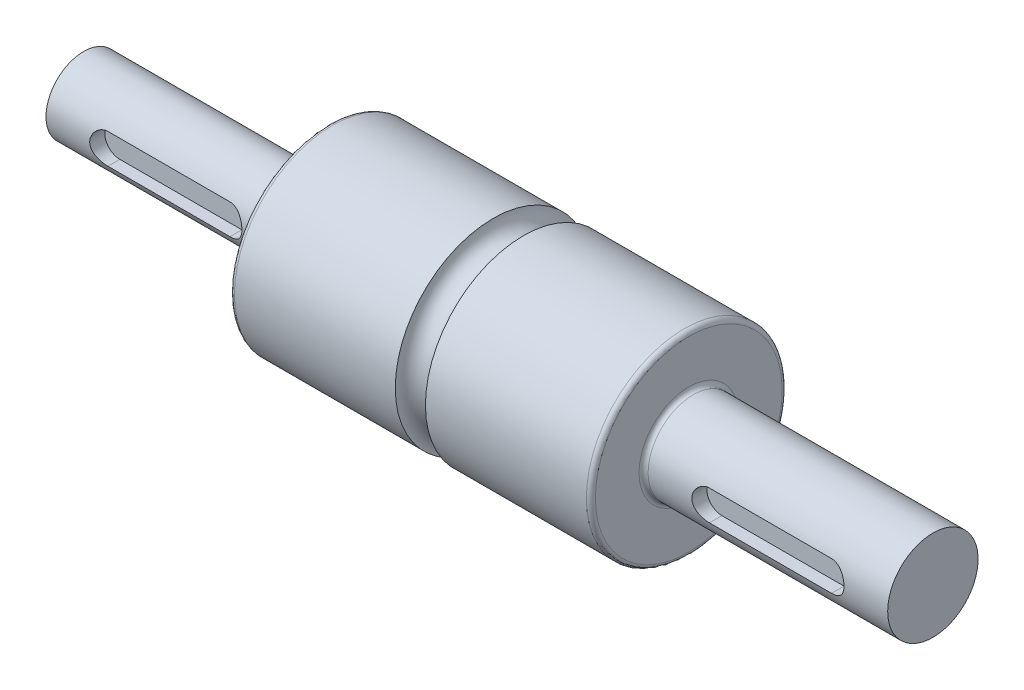
ISO-10303-21;
HEADER;
FILE_DESCRIPTION(('STEP AP214'),'2;1');
FILE_NAME('part.step','',(''),(''),'','','');
FILE_SCHEMA(('AUTOMOTIVE_DESIGN { 1 0 10303 214 1 1 1 1 }'));
ENDSEC;
DATA;
#1=APPLICATION_CONTEXT('core data for automotive mechanical design processes');
#2=APPLICATION_PROTOCOL_DEFINITION('international standard','automotive_design',2000,#1);
#3=PRODUCT_CONTEXT('',#1,'mechanical');
#4=PRODUCT('Part','Part','',(#3));
#5=PRODUCT_RELATED_PRODUCT_CATEGORY('part','',(#4));
#6=PRODUCT_DEFINITION_FORMATION('','',#4);
#7=PRODUCT_DEFINITION_CONTEXT('part definition',#1,'design');
#8=PRODUCT_DEFINITION('design','',#6,#7);
#9=PRODUCT_DEFINITION_SHAPE('','',#8);
#10=(LENGTH_UNIT() NAMED_UNIT(*) SI_UNIT(.MILLI.,.METRE.));
#11=(NAMED_UNIT(*) PLANE_ANGLE_UNIT() SI_UNIT($,.RADIAN.));
#12=(NAMED_UNIT(*) SI_UNIT($,.STERADIAN.) SOLID_ANGLE_UNIT());
#13=UNCERTAINTY_MEASURE_WITH_UNIT(LENGTH_MEASURE(1.E-05),#10,'distance_accuracy_value','');
#14=(GEOMETRIC_REPRESENTATION_CONTEXT(3) GLOBAL_UNCERTAINTY_ASSIGNED_CONTEXT((#13)) GLOBAL_UNIT_ASSIGNED_CONTEXT((#10,
#11,#12)) REPRESENTATION_CONTEXT('',''));
#15=CARTESIAN_POINT('',(0.,0.,0.));
#16=DIRECTION('',(0.,0.,1.));
#17=DIRECTION('',(1.,0.,0.));
#18=AXIS2_PLACEMENT_3D('',#15,#16,#17);
#19=CARTESIAN_POINT('',(-140.903426941993,0.,0.));
#20=DIRECTION('',(-1.,0.,0.));
#21=DIRECTION('',(0.,0.,1.));
#22=AXIS2_PLACEMENT_3D('',#19,#20,#21);
#23=CYLINDRICAL_SURFACE('',#22,12.5);
#24=CARTESIAN_POINT('',(-61.4034269419929,0.,0.));
#25=DIRECTION('',(-1.,0.,0.));
#26=DIRECTION('',(0.,0.,1.));
#27=AXIS2_PLACEMENT_3D('',#24,#25,#26);
#28=CIRCLE('',#27,12.5);
#29=CARTESIAN_POINT('',(-61.4034269419929,0.,12.5));
#30=VERTEX_POINT('',#29);
#31=EDGE_CURVE('E153',#30,#30,#28,.T.);
#32=ORIENTED_EDGE('',*,*,#31,.T.);
#33=EDGE_LOOP('',(#32));
#34=FACE_BOUND('',#33,.T.);
#35=CARTESIAN_POINT('',(-140.903426941993,0.,0.));
#36=DIRECTION('',(-1.,0.,0.));
#37=DIRECTION('',(0.,0.,1.));
#38=AXIS2_PLACEMENT_3D('',#35,#36,#37);
#39=CIRCLE('',#38,12.5);
#40=CARTESIAN_POINT('',(-140.903426941993,0.,12.5));
#41=VERTEX_POINT('',#40);
#42=EDGE_CURVE('E143',#41,#41,#39,.T.);
#43=ORIENTED_EDGE('',*,*,#42,.F.);
#44=EDGE_LOOP('',(#43));
#45=FACE_BOUND('',#44,.T.);
#46=CARTESIAN_POINT('',(-80.9034269419929,-4.99999999999999,11.4564392373896));
#47=CARTESIAN_POINT('',(-80.7689145099322,-5.00002116024615,11.4564109509945));
#48=CARTESIAN_POINT('',(-80.6344138774533,-4.99457288869912,11.4588073206432));
#49=CARTESIAN_POINT('',(-80.3664975973184,-4.97289704500258,11.4682409636927));
#50=CARTESIAN_POINT('',(-80.2330815560139,-4.956673578293,11.4752764695362));
#51=CARTESIAN_POINT('',(-79.9688120770579,-4.91369129558914,11.4937439172796));
#52=CARTESIAN_POINT('',(-79.8379506300949,-4.88697412617558,11.5051584758264));
#53=CARTESIAN_POINT('',(-79.5791673640281,-4.82328654884512,11.5320036246689));
#54=CARTESIAN_POINT('',(-79.4512457248801,-4.78631551505479,11.5474344601058));
#55=CARTESIAN_POINT('',(-79.1993475743696,-4.70252103978113,11.5818106822086));
#56=CARTESIAN_POINT('',(-79.0753660459993,-4.65571075709795,11.6007513709062));
#57=CARTESIAN_POINT('',(-78.8318982133711,-4.55261160789533,11.6415978912418));
#58=CARTESIAN_POINT('',(-78.712413619784,-4.49631917799882,11.6635048369856));
#59=CARTESIAN_POINT('',(-78.3616167016076,-4.31376922877806,11.7327894866887));
#60=CARTESIAN_POINT('',(-78.1379443037477,-4.17383337305164,11.7837334464308));
#61=CARTESIAN_POINT('',(-77.7052249611352,-3.85328699437739,11.8925290853841));
#62=CARTESIAN_POINT('',(-77.4975177463674,-3.67095756312254,11.9506010980043));
#63=CARTESIAN_POINT('',(-77.1145674128227,-3.27420643347812,12.0653248053599));
#64=CARTESIAN_POINT('',(-76.9393309589029,-3.05977816286385,12.1219762064459));
#65=CARTESIAN_POINT('',(-76.7012817321614,-2.71343385084923,12.2025476404464));
#66=CARTESIAN_POINT('',(-76.6248600926509,-2.59127203287565,12.2291340013039));
#67=CARTESIAN_POINT('',(-76.4826481872213,-2.34039970046144,12.2796116610866));
#68=CARTESIAN_POINT('',(-76.4168535406812,-2.2116919132934,12.3035040692708));
#69=CARTESIAN_POINT('',(-76.296471355473,-1.94856415474315,12.3479110926869));
#70=CARTESIAN_POINT('',(-76.2418850217459,-1.81414357108409,12.3684253447059));
#71=CARTESIAN_POINT('',(-76.1444868886821,-1.54063203940556,12.4054617264858));
#72=CARTESIAN_POINT('',(-76.1016693620618,-1.40154340020458,12.4219857975888));
#73=CARTESIAN_POINT('',(-76.0300074414814,-1.12649875188949,12.4498667432373));
#74=CARTESIAN_POINT('',(-76.0005908579256,-0.990712972335666,12.4614336192513));
#75=CARTESIAN_POINT('',(-75.9531428165173,-0.716923447432036,12.480177753411));
#76=CARTESIAN_POINT('',(-75.9351063772532,-0.578920699677037,12.4873569321328));
#77=CARTESIAN_POINT('',(-75.9106014092476,-0.301742928083764,12.4971268844119));
#78=CARTESIAN_POINT('',(-75.904131781342,-0.162568016896079,12.4997180939517));
#79=CARTESIAN_POINT('',(-75.902831267005,0.11584248401282,12.5002382405049));
#80=CARTESIAN_POINT('',(-75.9079999715092,0.255078071429409,12.4981673413824));
#81=CARTESIAN_POINT('',(-75.9292961273385,0.524651970400528,12.4896713366005));
#82=CARTESIAN_POINT('',(-75.9447886936776,0.655048966944706,12.4834985427991));
#83=CARTESIAN_POINT('',(-75.9859316516079,0.914022837957844,12.4672131439381));
#84=CARTESIAN_POINT('',(-76.0115854189115,1.04259909282974,12.4570992295938));
#85=CARTESIAN_POINT('',(-76.0728006142319,1.29697755626965,12.4331876533791));
#86=CARTESIAN_POINT('',(-76.1083586179993,1.42278070740582,12.4193912647406));
#87=CARTESIAN_POINT('',(-76.189060985113,1.67086757221269,12.3884570972524));
#88=CARTESIAN_POINT('',(-76.2342089890808,1.79314992921951,12.3713180496423));
#89=CARTESIAN_POINT('',(-76.3849727762489,2.15709687028231,12.3149325863107));
#90=CARTESIAN_POINT('',(-76.5050355642606,2.39225143382082,12.2710729537441));
#91=CARTESIAN_POINT('',(-76.7796028983251,2.83955938188376,12.175361464094));
#92=CARTESIAN_POINT('',(-76.9341195274145,3.05170465810878,12.1235068051106));
#93=CARTESIAN_POINT('',(-77.2850235281358,3.46189166322701,12.0130472510456));
#94=CARTESIAN_POINT('',(-77.4834922991716,3.65809600081908,11.9542226888218));
#95=CARTESIAN_POINT('',(-77.9109180274534,4.01527141902241,11.8390417472991));
#96=CARTESIAN_POINT('',(-78.1398887985308,4.17622644798527,11.7826865017702));
#97=CARTESIAN_POINT('',(-78.505471408025,4.38982639253536,11.7040767056709));
#98=CARTESIAN_POINT('',(-78.6330167098421,4.45714070918033,11.67853963431));
#99=CARTESIAN_POINT('',(-78.8939173367072,4.58068459393731,11.6306369662179));
#100=CARTESIAN_POINT('',(-79.0272701269839,4.6369189400321,11.6082700036232));
#101=CARTESIAN_POINT('',(-79.2987130988223,4.73770315812051,11.5675031334143));
#102=CARTESIAN_POINT('',(-79.4367971528492,4.78226754199409,11.5490983039107));
#103=CARTESIAN_POINT('',(-79.7167624038732,4.85931060760165,11.5168933461878));
#104=CARTESIAN_POINT('',(-79.8586418677499,4.89179470795395,11.5030911537407));
#105=CARTESIAN_POINT('',(-80.1502337506556,4.94524241843461,11.4802224777034));
#106=CARTESIAN_POINT('',(-80.3000446849432,4.96575156895816,11.4713433844497));
#107=CARTESIAN_POINT('',(-80.6010406036684,4.99314310596511,11.4594310700134));
#108=CARTESIAN_POINT('',(-80.7522246836546,5.00003388913651,11.4563942466884));
#109=CARTESIAN_POINT('',(-80.9034269419929,5.00000000000001,11.4564392373896));
#110=B_SPLINE_CURVE_WITH_KNOTS('',3,(#46,#47,#48,#49,#50,#51,#52,#53,#54,#55,#56,#57,#58,#59,
#60,#61,#62,#63,#64,#65,#66,#67,#68,#69,#70,#71,#72,#73,#74,#75,#76,#77,#78,#79,#80,#81,#82,#83,
#84,#85,#86,#87,#88,#89,#90,#91,#92,#93,#94,#95,#96,#97,#98,#99,#100,#101,#102,#103,#104,#105,
#106,#107,#108,#109),.UNSPECIFIED.,.F.,.F.,(4,2,2,2,2,2,2,2,2,2,2,2,2,2,2,2,2,2,2,2,2,2,2,2,2,2,
2,2,2,2,2,4),(0.,0.403387132772967,0.806620659758033,1.20826977817944,1.60994341778076,
2.01108324721977,2.41237416211888,3.21490253133678,4.05861785764903,4.90250617122555,
5.34163056425763,5.78057347846698,6.21956355621624,6.65833961990578,7.07604861266467,
7.49357463528173,7.91106097937955,8.32853264988811,8.72244552722556,9.11648937858481,
9.5103971636113,9.90445475472552,10.7036301452728,11.5030862504096,12.3549725889497,
13.2072460521693,13.6461605184395,14.0848852966823,14.5230618911476,14.9610417034976,
15.4147136276399,15.8681057435336),.UNSPECIFIED.);
#111=CARTESIAN_POINT('',(-80.9034269419929,-4.99999999999999,11.4564392373896));
#112=VERTEX_POINT('',#111);
#113=CARTESIAN_POINT('',(-80.9034269419929,5.00000000000001,11.4564392373896));
#114=VERTEX_POINT('',#113);
#115=EDGE_CURVE('E186',#112,#114,#110,.T.);
#116=ORIENTED_EDGE('',*,*,#115,.F.);
#117=DIRECTION('',(-1.,0.,0.));
#118=VECTOR('',#117,1.);
#119=CARTESIAN_POINT('',(-140.903426941993,-4.99999999999999,11.4564392373896));
#120=LINE('',#119,#118);
#121=CARTESIAN_POINT('',(-121.403426941993,-4.99999999999999,11.4564392373896));
#122=VERTEX_POINT('',#121);
#123=EDGE_CURVE('E219',#112,#122,#120,.T.);
#124=ORIENTED_EDGE('',*,*,#123,.T.);
#125=CARTESIAN_POINT('',(-121.403426941993,-4.99999999999999,11.4564392373896));
#126=CARTESIAN_POINT('',(-121.537939374054,-5.00002116024615,11.4564109509945));
#127=CARTESIAN_POINT('',(-121.672440006532,-4.99457288869912,11.4588073206432));
#128=CARTESIAN_POINT('',(-121.940356286667,-4.97289704500258,11.4682409636927));
#129=CARTESIAN_POINT('',(-122.073772327972,-4.95667357829299,11.4752764695362));
#130=CARTESIAN_POINT('',(-122.338041806928,-4.91369129558913,11.4937439172796));
#131=CARTESIAN_POINT('',(-122.468903253891,-4.88697412617557,11.5051584758264));
#132=CARTESIAN_POINT('',(-122.727686519958,-4.82328654884511,11.5320036246689));
#133=CARTESIAN_POINT('',(-122.855608159106,-4.78631551505477,11.5474344601058));
#134=CARTESIAN_POINT('',(-123.107506309616,-4.7025210397811,11.5818106822086));
#135=CARTESIAN_POINT('',(-123.231487837986,-4.65571075709793,11.6007513709062));
#136=CARTESIAN_POINT('',(-123.474955670615,-4.55261160789531,11.6415978912418));
#137=CARTESIAN_POINT('',(-123.594440264202,-4.49631917799879,11.6635048369856));
#138=CARTESIAN_POINT('',(-123.945237182378,-4.31376922877803,11.7327894866887));
#139=CARTESIAN_POINT('',(-124.168909580238,-4.17383337305161,11.7837334464308));
#140=CARTESIAN_POINT('',(-124.601628922851,-3.85328699437734,11.8925290853841));
#141=CARTESIAN_POINT('',(-124.809336137618,-3.67095756312249,11.9506010980043));
#142=CARTESIAN_POINT('',(-125.192286471163,-3.27420643347807,12.0653248053599));
#143=CARTESIAN_POINT('',(-125.367522925083,-3.0597781628638,12.1219762064459));
#144=CARTESIAN_POINT('',(-125.605572151824,-2.71343385084917,12.2025476404464));
#145=CARTESIAN_POINT('',(-125.681993791335,-2.59127203287558,12.229134001304));
#146=CARTESIAN_POINT('',(-125.824205696764,-2.34039970046137,12.2796116610866));
#147=CARTESIAN_POINT('',(-125.890000343305,-2.21169191329334,12.3035040692708));
#148=CARTESIAN_POINT('',(-126.010382528513,-1.9485641547431,12.3479110926869));
#149=CARTESIAN_POINT('',(-126.06496886224,-1.81414357108403,12.3684253447059));
#150=CARTESIAN_POINT('',(-126.162366995304,-1.5406320394055,12.4054617264858));
#151=CARTESIAN_POINT('',(-126.205184521924,-1.40154340020451,12.4219857975888));
#152=CARTESIAN_POINT('',(-126.276846442504,-1.12649875188942,12.4498667432373));
#153=CARTESIAN_POINT('',(-126.30626302606,-0.990712972335597,12.4614336192513));
#154=CARTESIAN_POINT('',(-126.353711067468,-0.716923447431965,12.480177753411));
#155=CARTESIAN_POINT('',(-126.371747506732,-0.578920699676965,12.4873569321328));
#156=CARTESIAN_POINT('',(-126.396252474738,-0.301742928083693,12.4971268844119));
#157=CARTESIAN_POINT('',(-126.402722102644,-0.162568016896009,12.4997180939517));
#158=CARTESIAN_POINT('',(-126.404022616981,0.115842484012888,12.5002382405049));
#159=CARTESIAN_POINT('',(-126.398853912476,0.255078071429476,12.4981673413824));
#160=CARTESIAN_POINT('',(-126.377557756647,0.524651970400594,12.4896713366005));
#161=CARTESIAN_POINT('',(-126.362065190308,0.655048966944771,12.4834985427991));
#162=CARTESIAN_POINT('',(-126.320922232378,0.914022837957908,12.4672131439381));
#163=CARTESIAN_POINT('',(-126.295268465074,1.0425990928298,12.4570992295938));
#164=CARTESIAN_POINT('',(-126.234053269754,1.29697755626972,12.4331876533791));
#165=CARTESIAN_POINT('',(-126.198495265986,1.42278070740589,12.4193912647406));
#166=CARTESIAN_POINT('',(-126.117792898873,1.67086757221275,12.3884570972524));
#167=CARTESIAN_POINT('',(-126.072644894905,1.79314992921957,12.3713180496423));
#168=CARTESIAN_POINT('',(-125.921881107737,2.15709687028237,12.3149325863107));
#169=CARTESIAN_POINT('',(-125.801818319725,2.39225143382088,12.2710729537441));
#170=CARTESIAN_POINT('',(-125.527250985661,2.83955938188382,12.175361464094));
#171=CARTESIAN_POINT('',(-125.372734356571,3.05170465810884,12.1235068051106));
#172=CARTESIAN_POINT('',(-125.02183035585,3.46189166322706,12.0130472510456));
#173=CARTESIAN_POINT('',(-124.823361584814,3.65809600081913,11.9542226888217));
#174=CARTESIAN_POINT('',(-124.395935856532,4.01527141902245,11.8390417472991));
#175=CARTESIAN_POINT('',(-124.166965085455,4.17622644798531,11.7826865017702));
#176=CARTESIAN_POINT('',(-123.801382475961,4.38982639253539,11.7040767056709));
#177=CARTESIAN_POINT('',(-123.673837174144,4.45714070918036,11.67853963431));
#178=CARTESIAN_POINT('',(-123.412936547278,4.58068459393734,11.6306369662179));
#179=CARTESIAN_POINT('',(-123.279583757002,4.63691894003213,11.6082700036232));
#180=CARTESIAN_POINT('',(-123.008140785163,4.73770315812053,11.5675031334143));
#181=CARTESIAN_POINT('',(-122.870056731136,4.78226754199411,11.5490983039106));
#182=CARTESIAN_POINT('',(-122.590091480112,4.85931060760167,11.5168933461878));
#183=CARTESIAN_POINT('',(-122.448212016236,4.89179470795396,11.5030911537407));
#184=CARTESIAN_POINT('',(-122.15662013333,4.94524241843462,11.4802224777034));
#185=CARTESIAN_POINT('',(-122.006809199042,4.96575156895816,11.4713433844497));
#186=CARTESIAN_POINT('',(-121.705813280317,4.99314310596511,11.4594310700134));
#187=CARTESIAN_POINT('',(-121.554629200331,5.00003388913651,11.4563942466884));
#188=CARTESIAN_POINT('',(-121.403426941993,5.00000000000001,11.4564392373896));
#189=B_SPLINE_CURVE_WITH_KNOTS('',3,(#125,#126,#127,#128,#129,#130,#131,#132,#133,#134,#135,
#136,#137,#138,#139,#140,#141,#142,#143,#144,#145,#146,#147,#148,#149,#150,#151,#152,#153,#154,
#155,#156,#157,#158,#159,#160,#161,#162,#163,#164,#165,#166,#167,#168,#169,#170,#171,#172,#173,
#174,#175,#176,#177,#178,#179,#180,#181,#182,#183,#184,#185,#186,#187,#188),.UNSPECIFIED.,.F.,
.F.,(4,2,2,2,2,2,2,2,2,2,2,2,2,2,2,2,2,2,2,2,2,2,2,2,2,2,2,2,2,2,2,4),(0.,0.403387132772981,
0.806620659758047,1.20826977817943,1.60994341778078,2.01108324721978,2.4123741621189,
3.21490253133681,4.05861785764907,4.90250617122559,5.34163056425766,5.780573478467,
6.21956355621627,6.65833961990581,7.07604861266471,7.49357463528176,7.91106097937958,
8.32853264988813,8.72244552722559,9.11648937858483,9.51039716361132,9.90445475472555,
10.7036301452729,11.5030862504097,12.3549725889497,13.2072460521693,13.6461605184396,
14.0848852966823,14.5230618911476,14.9610417034976,15.4147136276399,15.8681057435335),.UNSPECIFIED.);
#190=CARTESIAN_POINT('',(-121.403426941993,5.00000000000001,11.4564392373896));
#191=VERTEX_POINT('',#190);
#192=EDGE_CURVE('E56',#122,#191,#189,.T.);
#193=ORIENTED_EDGE('',*,*,#192,.T.);
#194=DIRECTION('',(-1.,0.,0.));
#195=VECTOR('',#194,1.);
#196=CARTESIAN_POINT('',(-140.903426941993,5.00000000000001,11.4564392373896));
#197=LINE('',#196,#195);
#198=EDGE_CURVE('E193',#114,#191,#197,.T.);
#199=ORIENTED_EDGE('',*,*,#198,.F.);
#200=EDGE_LOOP('',(#116,#124,#193,#199));
#201=FACE_BOUND('',#200,.T.);
#202=ADVANCED_FACE('F33',(#34,#45,#201),#23,.T.);
#203=CARTESIAN_POINT('',(140.903426941993,0.,-15.));
#204=DIRECTION('',(-1.,0.,0.));
#205=DIRECTION('',(0.,0.,1.));
#206=AXIS2_PLACEMENT_3D('',#203,#204,#205);
#207=PLANE('',#206);
#208=CARTESIAN_POINT('',(140.903426941993,0.,0.));
#209=DIRECTION('',(-1.,0.,0.));
#210=DIRECTION('',(0.,0.,1.));
#211=AXIS2_PLACEMENT_3D('',#208,#209,#210);
#212=CIRCLE('',#211,15.);
#213=CARTESIAN_POINT('',(140.903426941993,0.,15.));
#214=VERTEX_POINT('',#213);
#215=EDGE_CURVE('E183',#214,#214,#212,.T.);
#216=ORIENTED_EDGE('',*,*,#215,.F.);
#217=EDGE_LOOP('',(#216));
#218=FACE_BOUND('',#217,.T.);
#219=ADVANCED_FACE('F35',(#218),#207,.F.);
#220=CARTESIAN_POINT('',(-140.903426941993,0.,0.));
#221=DIRECTION('',(-1.,0.,0.));
#222=DIRECTION('',(0.,0.,1.));
#223=AXIS2_PLACEMENT_3D('',#220,#221,#222);
#224=CYLINDRICAL_SURFACE('',#223,15.);
#225=DIRECTION('',(-1.,0.,0.));
#226=VECTOR('',#225,1.);
#227=CARTESIAN_POINT('',(-140.903426941993,5.00000000000001,14.1421356237309));
#228=LINE('',#227,#226);
#229=CARTESIAN_POINT('',(80.9034269419929,5.00000000000001,14.1421356237309));
#230=VERTEX_POINT('',#229);
#231=CARTESIAN_POINT('',(121.403426941993,5.00000000000001,14.1421356237309));
#232=VERTEX_POINT('',#231);
#233=EDGE_CURVE('E11',#230,#232,#228,.F.);
#234=ORIENTED_EDGE('',*,*,#233,.T.);
#235=CARTESIAN_POINT('',(121.403426941993,5.00000000000001,14.1421356237309));
#236=CARTESIAN_POINT('',(121.5398387699,5.00001928272081,14.1421132795953));
#237=CARTESIAN_POINT('',(121.676241927634,4.99441839460029,14.144108585197));
#238=CARTESIAN_POINT('',(121.947990182087,4.97212026561632,14.1519707752355));
#239=CARTESIAN_POINT('',(122.083335554446,4.95542602013329,14.1578366145644));
#240=CARTESIAN_POINT('',(122.351605599094,4.9111504844288,14.1732535212275));
#241=CARTESIAN_POINT('',(122.484536238896,4.88360148534077,14.182793656248));
#242=CARTESIAN_POINT('',(122.74745158765,4.81787909036064,14.2052544389481));
#243=CARTESIAN_POINT('',(122.877436189951,4.7797053104926,14.2181752088016));
#244=CARTESIAN_POINT('',(123.133485940323,4.69309505128878,14.2469974292543));
#245=CARTESIAN_POINT('',(123.259554161886,4.64466686529956,14.2628964699579));
#246=CARTESIAN_POINT('',(123.507095489933,4.53792631398364,14.2972152683245));
#247=CARTESIAN_POINT('',(123.628566861094,4.47961026060575,14.3156359660384));
#248=CARTESIAN_POINT('',(123.984995870406,4.29042487291369,14.3739242294785));
#249=CARTESIAN_POINT('',(124.212077125632,4.14528130436111,14.4168308914588));
#250=CARTESIAN_POINT('',(124.647064812331,3.81524041281302,14.5077282855086));
#251=CARTESIAN_POINT('',(124.854011190976,3.62912046165337,14.5558450324036));
#252=CARTESIAN_POINT('',(125.23444718253,3.22494665570409,14.6506912904573));
#253=CARTESIAN_POINT('',(125.407930837861,3.00688712664706,14.6974205533428));
#254=CARTESIAN_POINT('',(125.720827276125,2.53801699448505,14.7856944680589));
#255=CARTESIAN_POINT('',(125.859232598254,2.28650011670838,14.8270719634014));
#256=CARTESIAN_POINT('',(126.091387466404,1.76214657981263,14.8984803449503));
#257=CARTESIAN_POINT('',(126.18515065388,1.48931646315736,14.9285146967399));
#258=CARTESIAN_POINT('',(126.322105762804,0.940146645163432,14.9729535792742));
#259=CARTESIAN_POINT('',(126.366943369091,0.664259156539295,14.9878654569488));
#260=CARTESIAN_POINT('',(126.410008370307,0.108494863035997,15.0021804126725));
#261=CARTESIAN_POINT('',(126.40824687138,-0.171380975391754,15.0015871861129));
#262=CARTESIAN_POINT('',(126.359205590794,-0.715519207983796,14.9853019394036));
#263=CARTESIAN_POINT('',(126.31371394512,-0.979963426373997,14.9702030725849));
#264=CARTESIAN_POINT('',(126.181460755688,-1.49722040864169,14.9273480020182));
#265=CARTESIAN_POINT('',(126.094696923543,-1.75003252671054,14.8995910964333));
#266=CARTESIAN_POINT('',(125.881320810713,-2.24076278220397,14.8337834991293));
#267=CARTESIAN_POINT('',(125.754199404086,-2.47844127676372,14.7956022127902));
#268=CARTESIAN_POINT('',(125.464124496602,-2.92962419733436,14.7129190630403));
#269=CARTESIAN_POINT('',(125.301161248662,-3.14312202351081,14.6684154814678));
#270=CARTESIAN_POINT('',(124.935082201863,-3.55048180391257,14.5753148518701));
#271=CARTESIAN_POINT('',(124.730439304146,-3.7429493917037,14.5266237190253));
#272=CARTESIAN_POINT('',(124.291179400284,-4.09137879648189,14.4323697370697));
#273=CARTESIAN_POINT('',(124.056552748239,-4.24732881968221,14.3868079019513));
#274=CARTESIAN_POINT('',(123.685035754024,-4.45137197181609,14.3244699574743));
#275=CARTESIAN_POINT('',(123.556857686034,-4.51477947987291,14.3045606178995));
#276=CARTESIAN_POINT('',(123.295220715797,-4.63050119526382,14.2675208843929));
#277=CARTESIAN_POINT('',(123.161764039398,-4.68282002045477,14.2503893343581));
#278=CARTESIAN_POINT('',(122.890655583785,-4.77584283639461,14.2194841629367));
#279=CARTESIAN_POINT('',(122.753008550613,-4.81655946314395,14.205706890793));
#280=CARTESIAN_POINT('',(122.474466748934,-4.88604801985986,14.1819560641116));
#281=CARTESIAN_POINT('',(122.333573494541,-4.91482540411387,14.1719807728584));
#282=CARTESIAN_POINT('',(122.061373883805,-4.95827453687229,14.156836654448));
#283=CARTESIAN_POINT('',(121.93024004252,-4.97391718926364,14.1513381564974));
#284=CARTESIAN_POINT('',(121.667216526118,-4.99478118687353,14.143980412972));
#285=CARTESIAN_POINT('',(121.535328047408,-5.00001597952915,14.1421164714419));
#286=CARTESIAN_POINT('',(121.403426941993,-4.99999999999999,14.142135623731));
#287=B_SPLINE_CURVE_WITH_KNOTS('',3,(#235,#236,#237,#238,#239,#240,#241,#242,#243,#244,#245,
#246,#247,#248,#249,#250,#251,#252,#253,#254,#255,#256,#257,#258,#259,#260,#261,#262,#263,#264,
#265,#266,#267,#268,#269,#270,#271,#272,#273,#274,#275,#276,#277,#278,#279,#280,#281,#282,#283,
#284,#285,#286),.UNSPECIFIED.,.F.,.F.,(4,2,2,2,2,2,2,2,2,2,2,2,2,2,2,2,2,2,2,2,2,2,2,2,2,4),(0.,
0.409092423677147,0.818074430847297,1.22584885885814,1.63363802561077,2.04109864022585,
2.44871156823775,3.26359482908313,4.10724851154042,4.95105225659391,5.8168799100616,
6.68244281946291,7.5178967997767,8.35315166493869,9.15564418669333,9.95818120881897,
10.7712742047049,11.584588592845,12.4361259663091,13.2879379758687,13.7206337000479,
14.1531488734623,14.5851911765746,15.0170358888757,15.4131122811713,15.8086765909866),.UNSPECIFIED.);
#288=CARTESIAN_POINT('',(121.403426941993,-4.99999999999999,14.142135623731));
#289=VERTEX_POINT('',#288);
#290=EDGE_CURVE('E222',#232,#289,#287,.T.);
#291=ORIENTED_EDGE('',*,*,#290,.T.);
#292=DIRECTION('',(-1.,0.,0.));
#293=VECTOR('',#292,1.);
#294=CARTESIAN_POINT('',(-140.903426941993,-4.99999999999999,14.142135623731));
#295=LINE('',#294,#293);
#296=CARTESIAN_POINT('',(80.9034269419929,-4.99999999999999,14.142135623731));
#297=VERTEX_POINT('',#296);
#298=EDGE_CURVE('E41',#289,#297,#295,.T.);
#299=ORIENTED_EDGE('',*,*,#298,.T.);
#300=CARTESIAN_POINT('',(80.9034269419929,-4.99999999999999,14.142135623731));
#301=CARTESIAN_POINT('',(80.767015114086,-5.0000192827208,14.1421132795953));
#302=CARTESIAN_POINT('',(80.6306119563519,-4.99441839460027,14.144108585197));
#303=CARTESIAN_POINT('',(80.3588637018987,-4.97212026561631,14.1519707752355));
#304=CARTESIAN_POINT('',(80.2235183295394,-4.95542602013328,14.1578366145644));
#305=CARTESIAN_POINT('',(79.9552482848919,-4.91115048442879,14.1732535212275));
#306=CARTESIAN_POINT('',(79.82231764509,-4.88360148534076,14.182793656248));
#307=CARTESIAN_POINT('',(79.5594022963353,-4.81787909036063,14.2052544389481));
#308=CARTESIAN_POINT('',(79.4294176940349,-4.77970531049259,14.2181752088016));
#309=CARTESIAN_POINT('',(79.173367943663,-4.69309505128877,14.2469974292543));
#310=CARTESIAN_POINT('',(79.0472997220997,-4.64466686529955,14.2628964699579));
#311=CARTESIAN_POINT('',(78.7997583940527,-4.53792631398363,14.2972152683245));
#312=CARTESIAN_POINT('',(78.6782870228913,-4.47961026060575,14.3156359660384));
#313=CARTESIAN_POINT('',(78.3218580135801,-4.29042487291369,14.3739242294785));
#314=CARTESIAN_POINT('',(78.094776758354,-4.14528130436111,14.4168308914588));
#315=CARTESIAN_POINT('',(77.6597890716549,-3.81524041281301,14.5077282855086));
#316=CARTESIAN_POINT('',(77.45284269301,-3.62912046165336,14.5558450324036));
#317=CARTESIAN_POINT('',(77.0724067014556,-3.22494665570406,14.6506912904573));
#318=CARTESIAN_POINT('',(76.8989230461245,-3.00688712664704,14.6974205533428));
#319=CARTESIAN_POINT('',(76.5860266078608,-2.53801699448503,14.7856944680589));
#320=CARTESIAN_POINT('',(76.4476212857322,-2.28650011670835,14.8270719634014));
#321=CARTESIAN_POINT('',(76.2154664175814,-1.7621465798126,14.8984803449503));
#322=CARTESIAN_POINT('',(76.1217032301055,-1.48931646315734,14.9285146967399));
#323=CARTESIAN_POINT('',(75.9847481211813,-0.940146645163422,14.9729535792742));
#324=CARTESIAN_POINT('',(75.9399105148952,-0.664259156539287,14.9878654569488));
#325=CARTESIAN_POINT('',(75.8968455136787,-0.108494863035997,15.0021804126725));
#326=CARTESIAN_POINT('',(75.8986070126052,0.171380975391749,15.0015871861129));
#327=CARTESIAN_POINT('',(75.9476482931914,0.715519207983782,14.9853019394036));
#328=CARTESIAN_POINT('',(75.9931399388661,0.979963426373979,14.9702030725849));
#329=CARTESIAN_POINT('',(76.1253931282982,1.49722040864167,14.9273480020182));
#330=CARTESIAN_POINT('',(76.2121569604428,1.75003252671053,14.8995910964333));
#331=CARTESIAN_POINT('',(76.4255330732724,2.24076278220396,14.8337834991293));
#332=CARTESIAN_POINT('',(76.5526544798993,2.47844127676371,14.7956022127902));
#333=CARTESIAN_POINT('',(76.8427293873832,2.92962419733436,14.7129190630403));
#334=CARTESIAN_POINT('',(77.0056926353233,3.1431220235108,14.6684154814678));
#335=CARTESIAN_POINT('',(77.3717716821229,3.55048180391257,14.5753148518701));
#336=CARTESIAN_POINT('',(77.5764145798401,3.7429493917037,14.5266237190253));
#337=CARTESIAN_POINT('',(78.0156744837014,4.09137879648189,14.4323697370697));
#338=CARTESIAN_POINT('',(78.2503011357472,4.24732881968221,14.3868079019513));
#339=CARTESIAN_POINT('',(78.6218181299618,4.45137197181609,14.3244699574743));
#340=CARTESIAN_POINT('',(78.7499961979514,4.51477947987291,14.3045606178995));
#341=CARTESIAN_POINT('',(79.0116331681888,4.63050119526382,14.2675208843929));
#342=CARTESIAN_POINT('',(79.1450898445874,4.68282002045477,14.2503893343581));
#343=CARTESIAN_POINT('',(79.4161983002006,4.77584283639461,14.2194841629367));
#344=CARTESIAN_POINT('',(79.5538453333728,4.81655946314395,14.205706890793));
#345=CARTESIAN_POINT('',(79.832387135052,4.88604801985987,14.1819560641116));
#346=CARTESIAN_POINT('',(79.973280389445,4.91482540411388,14.1719807728584));
#347=CARTESIAN_POINT('',(80.2454800001812,4.9582745368723,14.1568366544479));
#348=CARTESIAN_POINT('',(80.3766138414661,4.97391718926365,14.1513381564974));
#349=CARTESIAN_POINT('',(80.6396373578676,4.99478118687354,14.143980412972));
#350=CARTESIAN_POINT('',(80.7715258365777,5.00001597952917,14.1421164714419));
#351=CARTESIAN_POINT('',(80.9034269419929,5.00000000000001,14.1421356237309));
#352=B_SPLINE_CURVE_WITH_KNOTS('',3,(#300,#301,#302,#303,#304,#305,#306,#307,#308,#309,#310,
#311,#312,#313,#314,#315,#316,#317,#318,#319,#320,#321,#322,#323,#324,#325,#326,#327,#328,#329,
#330,#331,#332,#333,#334,#335,#336,#337,#338,#339,#340,#341,#342,#343,#344,#345,#346,#347,#348,
#349,#350,#351),.UNSPECIFIED.,.F.,.F.,(4,2,2,2,2,2,2,2,2,2,2,2,2,2,2,2,2,2,2,2,2,2,2,2,2,4),(0.,
0.409092423677161,0.818074430847311,1.22584885885817,1.63363802561077,2.04109864022585,
2.44871156823775,3.26359482908312,4.10724851154045,4.95105225659394,5.81687991006164,
6.68244281946293,7.51789679977671,8.35315166493868,9.15564418669332,9.95818120881896,
10.771274204705,11.584588592845,12.4361259663091,13.2879379758687,13.7206337000479,
14.1531488734623,14.5851911765746,15.0170358888757,15.4131122811714,15.8086765909867),.UNSPECIFIED.);
#353=EDGE_CURVE('E48',#297,#230,#352,.T.);
#354=ORIENTED_EDGE('',*,*,#353,.T.);
#355=EDGE_LOOP('',(#234,#291,#299,#354));
#356=FACE_BOUND('',#355,.T.);
#357=CARTESIAN_POINT('',(61.4034269419929,0.,0.));
#358=DIRECTION('',(-1.,0.,0.));
#359=DIRECTION('',(0.,0.,1.));
#360=AXIS2_PLACEMENT_3D('',#357,#358,#359);
#361=CIRCLE('',#360,15.);
#362=CARTESIAN_POINT('',(61.4034269419929,0.,15.));
#363=VERTEX_POINT('',#362);
#364=EDGE_CURVE('E180',#363,#363,#361,.T.);
#365=ORIENTED_EDGE('',*,*,#364,.F.);
#366=EDGE_LOOP('',(#365));
#367=FACE_BOUND('',#366,.T.);
#368=ORIENTED_EDGE('',*,*,#215,.T.);
#369=EDGE_LOOP('',(#368));
#370=FACE_BOUND('',#369,.T.);
#371=ADVANCED_FACE('F233',(#356,#367,#370),#224,.T.);
#372=CARTESIAN_POINT('',(61.4034269419928,0.,0.));
#373=DIRECTION('',(-1.,0.,0.));
#374=DIRECTION('',(0.,0.,1.));
#375=AXIS2_PLACEMENT_3D('',#372,#373,#374);
#376=TOROIDAL_SURFACE('',#375,16.5,1.5);
#377=CARTESIAN_POINT('',(59.9034269419928,0.,0.));
#378=DIRECTION('',(-1.,0.,0.));
#379=DIRECTION('',(0.,0.,1.));
#380=AXIS2_PLACEMENT_3D('',#377,#378,#379);
#381=CIRCLE('',#380,16.5);
#382=CARTESIAN_POINT('',(59.9034269419928,0.,16.5));
#383=VERTEX_POINT('',#382);
#384=EDGE_CURVE('E177',#383,#383,#381,.T.);
#385=ORIENTED_EDGE('',*,*,#384,.F.);
#386=EDGE_LOOP('',(#385));
#387=FACE_BOUND('',#386,.T.);
#388=ORIENTED_EDGE('',*,*,#364,.T.);
#389=EDGE_LOOP('',(#388));
#390=FACE_BOUND('',#389,.T.);
#391=ADVANCED_FACE('F298',(#387,#390),#376,.F.);
#392=CARTESIAN_POINT('',(59.9034269419928,0.,-31.));
#393=DIRECTION('',(-1.,0.,0.));
#394=DIRECTION('',(0.,0.,1.));
#395=AXIS2_PLACEMENT_3D('',#392,#393,#394);
#396=PLANE('',#395);
#397=CARTESIAN_POINT('',(59.9034269419928,0.,0.));
#398=DIRECTION('',(-1.,0.,0.));
#399=DIRECTION('',(0.,0.,1.));
#400=AXIS2_PLACEMENT_3D('',#397,#398,#399);
#401=CIRCLE('',#400,31.);
#402=CARTESIAN_POINT('',(59.9034269419928,0.,31.));
#403=VERTEX_POINT('',#402);
#404=EDGE_CURVE('E174',#403,#403,#401,.T.);
#405=ORIENTED_EDGE('',*,*,#404,.F.);
#406=EDGE_LOOP('',(#405));
#407=FACE_BOUND('',#406,.T.);
#408=ORIENTED_EDGE('',*,*,#384,.T.);
#409=EDGE_LOOP('',(#408));
#410=FACE_BOUND('',#409,.T.);
#411=ADVANCED_FACE('F342',(#407,#410),#396,.F.);
#412=CARTESIAN_POINT('',(58.4034269419928,0.,0.));
#413=DIRECTION('',(-1.,0.,0.));
#414=DIRECTION('',(0.,0.,1.));
#415=AXIS2_PLACEMENT_3D('',#412,#413,#414);
#416=TOROIDAL_SURFACE('',#415,31.,1.5);
#417=CARTESIAN_POINT('',(58.4034269419928,0.,0.));
#418=DIRECTION('',(-1.,0.,0.));
#419=DIRECTION('',(0.,0.,1.));
#420=AXIS2_PLACEMENT_3D('',#417,#418,#419);
#421=CIRCLE('',#420,32.5);
#422=CARTESIAN_POINT('',(58.4034269419928,0.,32.5));
#423=VERTEX_POINT('',#422);
#424=EDGE_CURVE('E171',#423,#423,#421,.T.);
#425=ORIENTED_EDGE('',*,*,#424,.F.);
#426=EDGE_LOOP('',(#425));
#427=FACE_BOUND('',#426,.T.);
#428=ORIENTED_EDGE('',*,*,#404,.T.);
#429=EDGE_LOOP('',(#428));
#430=FACE_BOUND('',#429,.T.);
#431=ADVANCED_FACE('F347',(#427,#430),#416,.T.);
#432=CARTESIAN_POINT('',(-140.903426941993,0.,0.));
#433=DIRECTION('',(-1.,0.,0.));
#434=DIRECTION('',(0.,0.,1.));
#435=AXIS2_PLACEMENT_3D('',#432,#433,#434);
#436=CYLINDRICAL_SURFACE('',#435,32.5);
#437=CARTESIAN_POINT('',(5.,0.,0.));
#438=DIRECTION('',(-1.,0.,0.));
#439=DIRECTION('',(0.,0.,1.));
#440=AXIS2_PLACEMENT_3D('',#437,#438,#439);
#441=CIRCLE('',#440,32.5);
#442=CARTESIAN_POINT('',(5.,0.,32.5));
#443=VERTEX_POINT('',#442);
#444=EDGE_CURVE('E168',#443,#443,#441,.T.);
#445=ORIENTED_EDGE('',*,*,#444,.F.);
#446=EDGE_LOOP('',(#445));
#447=FACE_BOUND('',#446,.T.);
#448=ORIENTED_EDGE('',*,*,#424,.T.);
#449=EDGE_LOOP('',(#448));
#450=FACE_BOUND('',#449,.T.);
#451=ADVANCED_FACE('F354',(#447,#450),#436,.T.);
#452=CARTESIAN_POINT('',(0.,0.,0.));
#453=DIRECTION('',(-1.,0.,0.));
#454=DIRECTION('',(0.,0.,1.));
#455=AXIS2_PLACEMENT_3D('',#452,#453,#454);
#456=TOROIDAL_SURFACE('',#455,32.5,4.99999999999999);
#457=CARTESIAN_POINT('',(-5.,0.,0.));
#458=DIRECTION('',(-1.,0.,0.));
#459=DIRECTION('',(0.,0.,1.));
#460=AXIS2_PLACEMENT_3D('',#457,#458,#459);
#461=CIRCLE('',#460,32.5);
#462=CARTESIAN_POINT('',(-5.,0.,32.5));
#463=VERTEX_POINT('',#462);
#464=EDGE_CURVE('E165',#463,#463,#461,.T.);
#465=ORIENTED_EDGE('',*,*,#464,.F.);
#466=EDGE_LOOP('',(#465));
#467=FACE_BOUND('',#466,.T.);
#468=ORIENTED_EDGE('',*,*,#444,.T.);
#469=EDGE_LOOP('',(#468));
#470=FACE_BOUND('',#469,.T.);
#471=ADVANCED_FACE('F358',(#467,#470),#456,.F.);
#472=CARTESIAN_POINT('',(-140.903426941993,0.,0.));
#473=DIRECTION('',(-1.,0.,0.));
#474=DIRECTION('',(0.,0.,1.));
#475=AXIS2_PLACEMENT_3D('',#472,#473,#474);
#476=CYLINDRICAL_SURFACE('',#475,32.5);
#477=CARTESIAN_POINT('',(-58.4034269419928,0.,0.));
#478=DIRECTION('',(-1.,0.,0.));
#479=DIRECTION('',(0.,0.,1.));
#480=AXIS2_PLACEMENT_3D('',#477,#478,#479);
#481=CIRCLE('',#480,32.5);
#482=CARTESIAN_POINT('',(-58.4034269419928,0.,32.5));
#483=VERTEX_POINT('',#482);
#484=EDGE_CURVE('E162',#483,#483,#481,.T.);
#485=ORIENTED_EDGE('',*,*,#484,.F.);
#486=EDGE_LOOP('',(#485));
#487=FACE_BOUND('',#486,.T.);
#488=ORIENTED_EDGE('',*,*,#464,.T.);
#489=EDGE_LOOP('',(#488));
#490=FACE_BOUND('',#489,.T.);
#491=ADVANCED_FACE('F362',(#487,#490),#476,.T.);
#492=CARTESIAN_POINT('',(-58.4034269419928,0.,0.));
#493=DIRECTION('',(-1.,0.,0.));
#494=DIRECTION('',(0.,0.,1.));
#495=AXIS2_PLACEMENT_3D('',#492,#493,#494);
#496=TOROIDAL_SURFACE('',#495,31.,1.5);
#497=CARTESIAN_POINT('',(-59.9034269419928,0.,0.));
#498=DIRECTION('',(-1.,0.,0.));
#499=DIRECTION('',(0.,0.,1.));
#500=AXIS2_PLACEMENT_3D('',#497,#498,#499);
#501=CIRCLE('',#500,31.);
#502=CARTESIAN_POINT('',(-59.9034269419928,0.,31.));
#503=VERTEX_POINT('',#502);
#504=EDGE_CURVE('E159',#503,#503,#501,.T.);
#505=ORIENTED_EDGE('',*,*,#504,.F.);
#506=EDGE_LOOP('',(#505));
#507=FACE_BOUND('',#506,.T.);
#508=ORIENTED_EDGE('',*,*,#484,.T.);
#509=EDGE_LOOP('',(#508));
#510=FACE_BOUND('',#509,.T.);
#511=ADVANCED_FACE('F366',(#507,#510),#496,.T.);
#512=CARTESIAN_POINT('',(-59.9034269419928,0.,-14.));
#513=DIRECTION('',(1.,0.,0.));
#514=DIRECTION('',(0.,0.,-1.));
#515=AXIS2_PLACEMENT_3D('',#512,#513,#514);
#516=PLANE('',#515);
#517=CARTESIAN_POINT('',(-59.9034269419928,0.,0.));
#518=DIRECTION('',(-1.,0.,0.));
#519=DIRECTION('',(0.,0.,1.));
#520=AXIS2_PLACEMENT_3D('',#517,#518,#519);
#521=CIRCLE('',#520,14.);
#522=CARTESIAN_POINT('',(-59.9034269419928,0.,14.));
#523=VERTEX_POINT('',#522);
#524=EDGE_CURVE('E156',#523,#523,#521,.T.);
#525=ORIENTED_EDGE('',*,*,#524,.F.);
#526=EDGE_LOOP('',(#525));
#527=FACE_BOUND('',#526,.T.);
#528=ORIENTED_EDGE('',*,*,#504,.T.);
#529=EDGE_LOOP('',(#528));
#530=FACE_BOUND('',#529,.T.);
#531=ADVANCED_FACE('F370',(#527,#530),#516,.F.);
#532=CARTESIAN_POINT('',(-61.4034269419928,0.,0.));
#533=DIRECTION('',(-1.,0.,0.));
#534=DIRECTION('',(0.,0.,1.));
#535=AXIS2_PLACEMENT_3D('',#532,#533,#534);
#536=TOROIDAL_SURFACE('',#535,14.,1.5);
#537=ORIENTED_EDGE('',*,*,#31,.F.);
#538=EDGE_LOOP('',(#537));
#539=FACE_BOUND('',#538,.T.);
#540=ORIENTED_EDGE('',*,*,#524,.T.);
#541=EDGE_LOOP('',(#540));
#542=FACE_BOUND('',#541,.T.);
#543=ADVANCED_FACE('F373',(#539,#542),#536,.F.);
#544=CARTESIAN_POINT('',(-140.903426941993,0.,0.));
#545=DIRECTION('',(1.,0.,0.));
#546=DIRECTION('',(0.,0.,-1.));
#547=AXIS2_PLACEMENT_3D('',#544,#545,#546);
#548=PLANE('',#547);
#549=ORIENTED_EDGE('',*,*,#42,.T.);
#550=EDGE_LOOP('',(#549));
#551=FACE_BOUND('',#550,.T.);
#552=ADVANCED_FACE('F214',(#551),#548,.F.);
#553=CARTESIAN_POINT('',(-121.403426941993,0.,7.5));
#554=DIRECTION('',(0.,0.,1.));
#555=DIRECTION('',(1.,0.,0.));
#556=AXIS2_PLACEMENT_3D('',#553,#554,#555);
#557=CYLINDRICAL_SURFACE('',#556,5.);
#558=DIRECTION('',(0.,0.,1.));
#559=VECTOR('',#558,1.);
#560=CARTESIAN_POINT('',(-121.403426941993,-4.99999999999999,7.5));
#561=LINE('',#560,#559);
#562=CARTESIAN_POINT('',(-121.403426941993,-4.99999999999999,7.5));
#563=VERTEX_POINT('',#562);
#564=EDGE_CURVE('E140',#563,#122,#561,.T.);
#565=ORIENTED_EDGE('',*,*,#564,.F.);
#566=CARTESIAN_POINT('',(-121.403426941993,0.,7.5));
#567=DIRECTION('',(0.,0.,1.));
#568=DIRECTION('',(1.,0.,0.));
#569=AXIS2_PLACEMENT_3D('',#566,#567,#568);
#570=CIRCLE('',#569,5.);
#571=CARTESIAN_POINT('',(-121.403426941993,5.00000000000001,7.5));
#572=VERTEX_POINT('',#571);
#573=EDGE_CURVE('E126',#572,#563,#570,.T.);
#574=ORIENTED_EDGE('',*,*,#573,.F.);
#575=DIRECTION('',(0.,0.,1.));
#576=VECTOR('',#575,1.);
#577=CARTESIAN_POINT('',(-121.403426941993,5.00000000000001,7.5));
#578=LINE('',#577,#576);
#579=EDGE_CURVE('E141',#572,#191,#578,.T.);
#580=ORIENTED_EDGE('',*,*,#579,.T.);
#581=ORIENTED_EDGE('',*,*,#192,.F.);
#582=EDGE_LOOP('',(#565,#574,#580,#581));
#583=FACE_BOUND('',#582,.T.);
#584=ADVANCED_FACE('F211',(#583),#557,.F.);
#585=CARTESIAN_POINT('',(-121.403426941993,5.00000000000001,7.5));
#586=DIRECTION('',(0.,-1.,0.));
#587=DIRECTION('',(0.,0.,-1.));
#588=AXIS2_PLACEMENT_3D('',#585,#586,#587);
#589=PLANE('',#588);
#590=ORIENTED_EDGE('',*,*,#198,.T.);
#591=ORIENTED_EDGE('',*,*,#579,.F.);
#592=DIRECTION('',(1.,0.,0.));
#593=VECTOR('',#592,1.);
#594=CARTESIAN_POINT('',(-121.403426941993,5.00000000000001,7.5));
#595=LINE('',#594,#593);
#596=CARTESIAN_POINT('',(-80.9034269419929,5.00000000000001,7.5));
#597=VERTEX_POINT('',#596);
#598=EDGE_CURVE('E138',#572,#597,#595,.T.);
#599=ORIENTED_EDGE('',*,*,#598,.T.);
#600=DIRECTION('',(0.,0.,1.));
#601=VECTOR('',#600,1.);
#602=CARTESIAN_POINT('',(-80.9034269419929,5.00000000000001,7.5));
#603=LINE('',#602,#601);
#604=EDGE_CURVE('E144',#597,#114,#603,.T.);
#605=ORIENTED_EDGE('',*,*,#604,.T.);
#606=EDGE_LOOP('',(#590,#591,#599,#605));
#607=FACE_BOUND('',#606,.T.);
#608=ADVANCED_FACE('F204',(#607),#589,.T.);
#609=CARTESIAN_POINT('',(-80.9034269419928,0.,7.5));
#610=DIRECTION('',(0.,0.,1.));
#611=DIRECTION('',(1.,0.,0.));
#612=AXIS2_PLACEMENT_3D('',#609,#610,#611);
#613=CYLINDRICAL_SURFACE('',#612,5.);
#614=DIRECTION('',(0.,0.,1.));
#615=VECTOR('',#614,1.);
#616=CARTESIAN_POINT('',(-80.9034269419929,-4.99999999999999,7.5));
#617=LINE('',#616,#615);
#618=CARTESIAN_POINT('',(-80.9034269419929,-4.99999999999999,7.5));
#619=VERTEX_POINT('',#618);
#620=EDGE_CURVE('E147',#619,#112,#617,.T.);
#621=ORIENTED_EDGE('',*,*,#620,.T.);
#622=ORIENTED_EDGE('',*,*,#115,.T.);
#623=ORIENTED_EDGE('',*,*,#604,.F.);
#624=CARTESIAN_POINT('',(-80.9034269419928,0.,7.5));
#625=DIRECTION('',(0.,0.,-1.));
#626=DIRECTION('',(-1.,0.,0.));
#627=AXIS2_PLACEMENT_3D('',#624,#625,#626);
#628=CIRCLE('',#627,5.);
#629=EDGE_CURVE('E136',#597,#619,#628,.T.);
#630=ORIENTED_EDGE('',*,*,#629,.T.);
#631=EDGE_LOOP('',(#621,#622,#623,#630));
#632=FACE_BOUND('',#631,.T.);
#633=ADVANCED_FACE('F198',(#632),#613,.F.);
#634=CARTESIAN_POINT('',(-121.403426941993,-4.99999999999999,7.5));
#635=DIRECTION('',(0.,-1.,0.));
#636=DIRECTION('',(0.,0.,-1.));
#637=AXIS2_PLACEMENT_3D('',#634,#635,#636);
#638=PLANE('',#637);
#639=ORIENTED_EDGE('',*,*,#620,.F.);
#640=DIRECTION('',(1.,0.,0.));
#641=VECTOR('',#640,1.);
#642=CARTESIAN_POINT('',(-121.403426941993,-4.99999999999999,7.5));
#643=LINE('',#642,#641);
#644=EDGE_CURVE('E133',#563,#619,#643,.T.);
#645=ORIENTED_EDGE('',*,*,#644,.F.);
#646=ORIENTED_EDGE('',*,*,#564,.T.);
#647=ORIENTED_EDGE('',*,*,#123,.F.);
#648=EDGE_LOOP('',(#639,#645,#646,#647));
#649=FACE_BOUND('',#648,.T.);
#650=ADVANCED_FACE('F203',(#649),#638,.F.);
#651=CARTESIAN_POINT('',(-121.403426941993,0.,7.5));
#652=DIRECTION('',(0.,0.,1.));
#653=DIRECTION('',(1.,0.,0.));
#654=AXIS2_PLACEMENT_3D('',#651,#652,#653);
#655=PLANE('',#654);
#656=ORIENTED_EDGE('',*,*,#573,.T.);
#657=ORIENTED_EDGE('',*,*,#644,.T.);
#658=ORIENTED_EDGE('',*,*,#629,.F.);
#659=ORIENTED_EDGE('',*,*,#598,.F.);
#660=EDGE_LOOP('',(#656,#657,#658,#659));
#661=FACE_BOUND('',#660,.T.);
#662=ADVANCED_FACE('F209',(#661),#655,.T.);
#663=CARTESIAN_POINT('',(80.9034269419928,0.,10.));
#664=DIRECTION('',(0.,0.,1.));
#665=DIRECTION('',(1.,0.,0.));
#666=AXIS2_PLACEMENT_3D('',#663,#664,#665);
#667=CYLINDRICAL_SURFACE('',#666,5.);
#668=DIRECTION('',(0.,0.,1.));
#669=VECTOR('',#668,1.);
#670=CARTESIAN_POINT('',(80.9034269419929,-4.99999999999999,10.));
#671=LINE('',#670,#669);
#672=CARTESIAN_POINT('',(80.9034269419929,-4.99999999999999,10.));
#673=VERTEX_POINT('',#672);
#674=EDGE_CURVE('E98',#673,#297,#671,.T.);
#675=ORIENTED_EDGE('',*,*,#674,.F.);
#676=CARTESIAN_POINT('',(80.9034269419928,0.,10.));
#677=DIRECTION('',(0.,0.,1.));
#678=DIRECTION('',(1.,0.,0.));
#679=AXIS2_PLACEMENT_3D('',#676,#677,#678);
#680=CIRCLE('',#679,5.);
#681=CARTESIAN_POINT('',(80.9034269419929,5.00000000000001,10.));
#682=VERTEX_POINT('',#681);
#683=EDGE_CURVE('E102',#682,#673,#680,.T.);
#684=ORIENTED_EDGE('',*,*,#683,.F.);
#685=DIRECTION('',(0.,0.,1.));
#686=VECTOR('',#685,1.);
#687=CARTESIAN_POINT('',(80.9034269419929,5.00000000000001,10.));
#688=LINE('',#687,#686);
#689=EDGE_CURVE('E124',#682,#230,#688,.T.);
#690=ORIENTED_EDGE('',*,*,#689,.T.);
#691=ORIENTED_EDGE('',*,*,#353,.F.);
#692=EDGE_LOOP('',(#675,#684,#690,#691));
#693=FACE_BOUND('',#692,.T.);
#694=ADVANCED_FACE('F100',(#693),#667,.F.);
#695=CARTESIAN_POINT('',(80.9034269419929,5.00000000000001,10.));
#696=DIRECTION('',(0.,1.,0.));
#697=DIRECTION('',(0.,0.,1.));
#698=AXIS2_PLACEMENT_3D('',#695,#696,#697);
#699=PLANE('',#698);
#700=ORIENTED_EDGE('',*,*,#689,.F.);
#701=DIRECTION('',(-1.,0.,0.));
#702=VECTOR('',#701,1.);
#703=CARTESIAN_POINT('',(80.9034269419929,5.00000000000001,10.));
#704=LINE('',#703,#702);
#705=CARTESIAN_POINT('',(121.403426941993,5.00000000000001,10.));
#706=VERTEX_POINT('',#705);
#707=EDGE_CURVE('E107',#706,#682,#704,.T.);
#708=ORIENTED_EDGE('',*,*,#707,.F.);
#709=DIRECTION('',(0.,0.,1.));
#710=VECTOR('',#709,1.);
#711=CARTESIAN_POINT('',(121.403426941993,5.00000000000001,10.));
#712=LINE('',#711,#710);
#713=EDGE_CURVE('E127',#706,#232,#712,.T.);
#714=ORIENTED_EDGE('',*,*,#713,.T.);
#715=ORIENTED_EDGE('',*,*,#233,.F.);
#716=EDGE_LOOP('',(#700,#708,#714,#715));
#717=FACE_BOUND('',#716,.T.);
#718=ADVANCED_FACE('F241',(#717),#699,.F.);
#719=CARTESIAN_POINT('',(121.403426941993,0.,10.));
#720=DIRECTION('',(0.,0.,1.));
#721=DIRECTION('',(1.,0.,0.));
#722=AXIS2_PLACEMENT_3D('',#719,#720,#721);
#723=CYLINDRICAL_SURFACE('',#722,5.);
#724=ORIENTED_EDGE('',*,*,#713,.F.);
#725=CARTESIAN_POINT('',(121.403426941993,0.,10.));
#726=DIRECTION('',(0.,0.,1.));
#727=DIRECTION('',(-1.,0.,0.));
#728=AXIS2_PLACEMENT_3D('',#725,#726,#727);
#729=CIRCLE('',#728,5.);
#730=CARTESIAN_POINT('',(121.403426941993,-4.99999999999999,10.));
#731=VERTEX_POINT('',#730);
#732=EDGE_CURVE('E116',#731,#706,#729,.T.);
#733=ORIENTED_EDGE('',*,*,#732,.F.);
#734=DIRECTION('',(0.,0.,1.));
#735=VECTOR('',#734,1.);
#736=CARTESIAN_POINT('',(121.403426941993,-4.99999999999999,10.));
#737=LINE('',#736,#735);
#738=EDGE_CURVE('E106',#731,#289,#737,.T.);
#739=ORIENTED_EDGE('',*,*,#738,.T.);
#740=ORIENTED_EDGE('',*,*,#290,.F.);
#741=EDGE_LOOP('',(#724,#733,#739,#740));
#742=FACE_BOUND('',#741,.T.);
#743=ADVANCED_FACE('F236',(#742),#723,.F.);
#744=CARTESIAN_POINT('',(80.9034269419929,-4.99999999999999,10.));
#745=DIRECTION('',(0.,-1.,0.));
#746=DIRECTION('',(0.,0.,-1.));
#747=AXIS2_PLACEMENT_3D('',#744,#745,#746);
#748=PLANE('',#747);
#749=ORIENTED_EDGE('',*,*,#738,.F.);
#750=DIRECTION('',(1.,0.,0.));
#751=VECTOR('',#750,1.);
#752=CARTESIAN_POINT('',(80.9034269419929,-4.99999999999999,10.));
#753=LINE('',#752,#751);
#754=EDGE_CURVE('E110',#673,#731,#753,.T.);
#755=ORIENTED_EDGE('',*,*,#754,.F.);
#756=ORIENTED_EDGE('',*,*,#674,.T.);
#757=ORIENTED_EDGE('',*,*,#298,.F.);
#758=EDGE_LOOP('',(#749,#755,#756,#757));
#759=FACE_BOUND('',#758,.T.);
#760=ADVANCED_FACE('F111',(#759),#748,.F.);
#761=CARTESIAN_POINT('',(80.9034269419928,0.,10.));
#762=DIRECTION('',(0.,0.,1.));
#763=DIRECTION('',(1.,0.,0.));
#764=AXIS2_PLACEMENT_3D('',#761,#762,#763);
#765=PLANE('',#764);
#766=ORIENTED_EDGE('',*,*,#683,.T.);
#767=ORIENTED_EDGE('',*,*,#754,.T.);
#768=ORIENTED_EDGE('',*,*,#732,.T.);
#769=ORIENTED_EDGE('',*,*,#707,.T.);
#770=EDGE_LOOP('',(#766,#767,#768,#769));
#771=FACE_BOUND('',#770,.T.);
#772=ADVANCED_FACE('F118',(#771),#765,.T.);
#773=CLOSED_SHELL('',(#202,#219,#371,#391,#411,#431,#451,#471,#491,#511,#531,#543,#552,#584,
#608,#633,#650,#662,#694,#718,#743,#760,#772));
#774=MANIFOLD_SOLID_BREP('B2',#773);
#775=ADVANCED_BREP_SHAPE_REPRESENTATION('',(#18,#774),#14);
#776=SHAPE_DEFINITION_REPRESENTATION(#9,#775);
ENDSEC;
END-ISO-10303-21;
